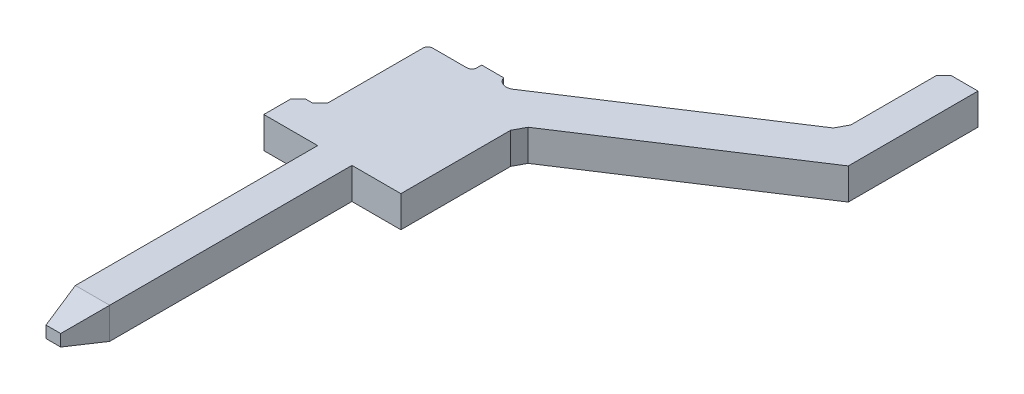
ISO-10303-21;
HEADER;
FILE_DESCRIPTION(('STEP AP214'),'2;1');
FILE_NAME('part.step','',(''),(''),'','','');
FILE_SCHEMA(('AUTOMOTIVE_DESIGN { 1 0 10303 214 1 1 1 1 }'));
ENDSEC;
DATA;
#1=APPLICATION_CONTEXT('core data for automotive mechanical design processes');
#2=APPLICATION_PROTOCOL_DEFINITION('international standard','automotive_design',2000,#1);
#3=PRODUCT_CONTEXT('',#1,'mechanical');
#4=PRODUCT('Part','Part','',(#3));
#5=PRODUCT_RELATED_PRODUCT_CATEGORY('part','',(#4));
#6=PRODUCT_DEFINITION_FORMATION('','',#4);
#7=PRODUCT_DEFINITION_CONTEXT('part definition',#1,'design');
#8=PRODUCT_DEFINITION('design','',#6,#7);
#9=PRODUCT_DEFINITION_SHAPE('','',#8);
#10=(LENGTH_UNIT() NAMED_UNIT(*) SI_UNIT(.MILLI.,.METRE.));
#11=(NAMED_UNIT(*) PLANE_ANGLE_UNIT() SI_UNIT($,.RADIAN.));
#12=(NAMED_UNIT(*) SI_UNIT($,.STERADIAN.) SOLID_ANGLE_UNIT());
#13=UNCERTAINTY_MEASURE_WITH_UNIT(LENGTH_MEASURE(1.E-05),#10,'distance_accuracy_value','');
#14=(GEOMETRIC_REPRESENTATION_CONTEXT(3) GLOBAL_UNCERTAINTY_ASSIGNED_CONTEXT((#13)) GLOBAL_UNIT_ASSIGNED_CONTEXT((#10,
#11,#12)) REPRESENTATION_CONTEXT('',''));
#15=CARTESIAN_POINT('',(0.,0.,0.));
#16=DIRECTION('',(0.,0.,1.));
#17=DIRECTION('',(1.,0.,0.));
#18=AXIS2_PLACEMENT_3D('',#15,#16,#17);
#19=CARTESIAN_POINT('',(-1.67,-16.82,-6.24));
#20=DIRECTION('',(0.,-1.,0.));
#21=DIRECTION('',(0.,0.,-1.));
#22=AXIS2_PLACEMENT_3D('',#19,#20,#21);
#23=CYLINDRICAL_SURFACE('',#22,0.1);
#24=CARTESIAN_POINT('',(-1.67,-16.82,-6.24));
#25=DIRECTION('',(0.,1.,0.));
#26=DIRECTION('',(0.,0.,-1.));
#27=AXIS2_PLACEMENT_3D('',#24,#25,#26);
#28=CIRCLE('',#27,0.1);
#29=CARTESIAN_POINT('',(-1.67,-16.82,-6.14));
#30=VERTEX_POINT('',#29);
#31=CARTESIAN_POINT('',(-1.57,-16.82,-6.24));
#32=VERTEX_POINT('',#31);
#33=EDGE_CURVE('E248',#30,#32,#28,.T.);
#34=ORIENTED_EDGE('',*,*,#33,.F.);
#35=DIRECTION('',(0.,-1.,0.));
#36=VECTOR('',#35,1.);
#37=CARTESIAN_POINT('',(-1.67,-16.82,-6.14));
#38=LINE('',#37,#36);
#39=CARTESIAN_POINT('',(-1.67,-16.18,-6.14));
#40=VERTEX_POINT('',#39);
#41=EDGE_CURVE('E308',#40,#30,#38,.T.);
#42=ORIENTED_EDGE('',*,*,#41,.F.);
#43=CARTESIAN_POINT('',(-1.67,-16.18,-6.24));
#44=DIRECTION('',(0.,-1.,0.));
#45=DIRECTION('',(0.,0.,-1.));
#46=AXIS2_PLACEMENT_3D('',#43,#44,#45);
#47=CIRCLE('',#46,0.1);
#48=CARTESIAN_POINT('',(-1.57,-16.18,-6.24));
#49=VERTEX_POINT('',#48);
#50=EDGE_CURVE('E41',#49,#40,#47,.T.);
#51=ORIENTED_EDGE('',*,*,#50,.F.);
#52=DIRECTION('',(0.,1.,0.));
#53=VECTOR('',#52,1.);
#54=CARTESIAN_POINT('',(-1.57,-16.18,-6.24));
#55=LINE('',#54,#53);
#56=EDGE_CURVE('E252',#32,#49,#55,.T.);
#57=ORIENTED_EDGE('',*,*,#56,.F.);
#58=EDGE_LOOP('',(#34,#42,#51,#57));
#59=FACE_BOUND('',#58,.T.);
#60=ADVANCED_FACE('F16',(#59),#23,.F.);
#61=CARTESIAN_POINT('',(-2.37,-16.82,-6.04));
#62=DIRECTION('',(0.,1.,0.));
#63=DIRECTION('',(0.,0.,1.));
#64=AXIS2_PLACEMENT_3D('',#61,#62,#63);
#65=CYLINDRICAL_SURFACE('',#64,0.1);
#66=CARTESIAN_POINT('',(-2.37,-16.82,-6.04));
#67=DIRECTION('',(0.,-1.,0.));
#68=DIRECTION('',(0.,0.,-1.));
#69=AXIS2_PLACEMENT_3D('',#66,#67,#68);
#70=CIRCLE('',#69,0.1);
#71=CARTESIAN_POINT('',(-2.47,-16.82,-6.04));
#72=VERTEX_POINT('',#71);
#73=CARTESIAN_POINT('',(-2.37,-16.82,-6.14));
#74=VERTEX_POINT('',#73);
#75=EDGE_CURVE('E386',#72,#74,#70,.T.);
#76=ORIENTED_EDGE('',*,*,#75,.F.);
#77=DIRECTION('',(0.,-1.,0.));
#78=VECTOR('',#77,1.);
#79=CARTESIAN_POINT('',(-2.47,-16.82,-6.04));
#80=LINE('',#79,#78);
#81=CARTESIAN_POINT('',(-2.47,-16.18,-6.04));
#82=VERTEX_POINT('',#81);
#83=EDGE_CURVE('E307',#82,#72,#80,.T.);
#84=ORIENTED_EDGE('',*,*,#83,.F.);
#85=CARTESIAN_POINT('',(-2.37,-16.18,-6.04));
#86=DIRECTION('',(0.,1.,0.));
#87=DIRECTION('',(0.,0.,-1.));
#88=AXIS2_PLACEMENT_3D('',#85,#86,#87);
#89=CIRCLE('',#88,0.1);
#90=CARTESIAN_POINT('',(-2.37,-16.18,-6.14));
#91=VERTEX_POINT('',#90);
#92=EDGE_CURVE('E361',#91,#82,#89,.T.);
#93=ORIENTED_EDGE('',*,*,#92,.F.);
#94=DIRECTION('',(0.,1.,0.));
#95=VECTOR('',#94,1.);
#96=CARTESIAN_POINT('',(-2.37,-16.82,-6.14));
#97=LINE('',#96,#95);
#98=EDGE_CURVE('E343',#74,#91,#97,.T.);
#99=ORIENTED_EDGE('',*,*,#98,.F.);
#100=EDGE_LOOP('',(#76,#84,#93,#99));
#101=FACE_BOUND('',#100,.T.);
#102=ADVANCED_FACE('F753',(#101),#65,.T.);
#103=CARTESIAN_POINT('',(-1.32,-16.82,2.51));
#104=DIRECTION('',(-0.970142500145332,0.,-0.242535625036333));
#105=DIRECTION('',(-0.242535625036333,0.,0.970142500145332));
#106=AXIS2_PLACEMENT_3D('',#103,#104,#105);
#107=PLANE('',#106);
#108=DIRECTION('',(0.235702260395516,-0.235702260395515,-0.942809041582064));
#109=VECTOR('',#108,1.);
#110=CARTESIAN_POINT('',(-1.34777777777778,-16.5922222222222,2.62111111111111));
#111=LINE('',#110,#109);
#112=CARTESIAN_POINT('',(-1.32,-16.62,2.51));
#113=VERTEX_POINT('',#112);
#114=CARTESIAN_POINT('',(-1.12,-16.82,1.71));
#115=VERTEX_POINT('',#114);
#116=EDGE_CURVE('E27',#113,#115,#111,.T.);
#117=ORIENTED_EDGE('',*,*,#116,.T.);
#118=DIRECTION('',(0.,-1.,0.));
#119=VECTOR('',#118,1.);
#120=CARTESIAN_POINT('',(-1.12,-16.82,1.71));
#121=LINE('',#120,#119);
#122=CARTESIAN_POINT('',(-1.12,-16.18,1.71));
#123=VERTEX_POINT('',#122);
#124=EDGE_CURVE('E287',#123,#115,#121,.T.);
#125=ORIENTED_EDGE('',*,*,#124,.F.);
#126=DIRECTION('',(-0.235702260395516,-0.235702260395515,0.942809041582064));
#127=VECTOR('',#126,1.);
#128=CARTESIAN_POINT('',(-1.10941237113952,-16.1694123711395,1.66764948455807));
#129=LINE('',#128,#127);
#130=CARTESIAN_POINT('',(-1.32,-16.38,2.51));
#131=VERTEX_POINT('',#130);
#132=EDGE_CURVE('E11',#123,#131,#129,.T.);
#133=ORIENTED_EDGE('',*,*,#132,.T.);
#134=DIRECTION('',(0.,1.,0.));
#135=VECTOR('',#134,1.);
#136=CARTESIAN_POINT('',(-1.32,-16.82,2.51));
#137=LINE('',#136,#135);
#138=EDGE_CURVE('E438',#113,#131,#137,.T.);
#139=ORIENTED_EDGE('',*,*,#138,.F.);
#140=EDGE_LOOP('',(#117,#125,#133,#139));
#141=FACE_BOUND('',#140,.T.);
#142=ADVANCED_FACE('F572',(#141),#107,.F.);
#143=CARTESIAN_POINT('',(-0.92942268051132,-16.18,1.71));
#144=DIRECTION('',(0.,0.970142500145332,0.242535625036333));
#145=DIRECTION('',(1.,0.,0.));
#146=AXIS2_PLACEMENT_3D('',#143,#144,#145);
#147=PLANE('',#146);
#148=DIRECTION('',(0.235702260395515,-0.235702260395516,0.942809041582064));
#149=VECTOR('',#148,1.);
#150=CARTESIAN_POINT('',(-1.78444444444444,-16.2155555555556,1.85222222222222));
#151=LINE('',#150,#149);
#152=CARTESIAN_POINT('',(-1.82,-16.18,1.71));
#153=VERTEX_POINT('',#152);
#154=CARTESIAN_POINT('',(-1.62,-16.38,2.51));
#155=VERTEX_POINT('',#154);
#156=EDGE_CURVE('E489',#153,#155,#151,.T.);
#157=ORIENTED_EDGE('',*,*,#156,.T.);
#158=DIRECTION('',(-1.,0.,0.));
#159=VECTOR('',#158,1.);
#160=CARTESIAN_POINT('',(-1.82,-16.38,2.51));
#161=LINE('',#160,#159);
#162=EDGE_CURVE('E20',#131,#155,#161,.T.);
#163=ORIENTED_EDGE('',*,*,#162,.F.);
#164=ORIENTED_EDGE('',*,*,#132,.F.);
#165=DIRECTION('',(1.,0.,0.));
#166=VECTOR('',#165,1.);
#167=CARTESIAN_POINT('',(-1.12,-16.18,1.71));
#168=LINE('',#167,#166);
#169=EDGE_CURVE('E321',#153,#123,#168,.T.);
#170=ORIENTED_EDGE('',*,*,#169,.F.);
#171=EDGE_LOOP('',(#157,#163,#164,#170));
#172=FACE_BOUND('',#171,.T.);
#173=ADVANCED_FACE('F578',(#172),#147,.T.);
#174=CARTESIAN_POINT('',(-1.82,-16.62,2.51));
#175=DIRECTION('',(0.,0.970142500145332,-0.242535625036333));
#176=DIRECTION('',(-1.,0.,0.));
#177=AXIS2_PLACEMENT_3D('',#174,#175,#176);
#178=PLANE('',#177);
#179=DIRECTION('',(-0.235702260395515,-0.235702260395516,-0.942809041582064));
#180=VECTOR('',#179,1.);
#181=CARTESIAN_POINT('',(-1.63111111111111,-16.6311111111111,2.46555555555556));
#182=LINE('',#181,#180);
#183=CARTESIAN_POINT('',(-1.62,-16.62,2.51));
#184=VERTEX_POINT('',#183);
#185=CARTESIAN_POINT('',(-1.82,-16.82,1.71));
#186=VERTEX_POINT('',#185);
#187=EDGE_CURVE('E486',#184,#186,#182,.T.);
#188=ORIENTED_EDGE('',*,*,#187,.T.);
#189=DIRECTION('',(-1.,0.,0.));
#190=VECTOR('',#189,1.);
#191=CARTESIAN_POINT('',(-0.92942268051132,-16.82,1.71));
#192=LINE('',#191,#190);
#193=EDGE_CURVE('E428',#115,#186,#192,.T.);
#194=ORIENTED_EDGE('',*,*,#193,.F.);
#195=ORIENTED_EDGE('',*,*,#116,.F.);
#196=DIRECTION('',(1.,0.,0.));
#197=VECTOR('',#196,1.);
#198=CARTESIAN_POINT('',(-1.82,-16.62,2.51));
#199=LINE('',#198,#197);
#200=EDGE_CURVE('E442',#184,#113,#199,.T.);
#201=ORIENTED_EDGE('',*,*,#200,.F.);
#202=EDGE_LOOP('',(#188,#194,#195,#201));
#203=FACE_BOUND('',#202,.T.);
#204=ADVANCED_FACE('F566',(#203),#178,.F.);
#205=CARTESIAN_POINT('',(-1.82,-16.82,1.71));
#206=DIRECTION('',(0.970142500145332,0.,-0.242535625036332));
#207=DIRECTION('',(0.,-1.,0.));
#208=AXIS2_PLACEMENT_3D('',#205,#206,#207);
#209=PLANE('',#208);
#210=ORIENTED_EDGE('',*,*,#156,.F.);
#211=DIRECTION('',(0.,1.,0.));
#212=VECTOR('',#211,1.);
#213=CARTESIAN_POINT('',(-1.82,-16.82,1.71));
#214=LINE('',#213,#212);
#215=EDGE_CURVE('E455',#186,#153,#214,.T.);
#216=ORIENTED_EDGE('',*,*,#215,.F.);
#217=ORIENTED_EDGE('',*,*,#187,.F.);
#218=DIRECTION('',(0.,-1.,0.));
#219=VECTOR('',#218,1.);
#220=CARTESIAN_POINT('',(-1.62,-16.82,2.51));
#221=LINE('',#220,#219);
#222=EDGE_CURVE('E329',#155,#184,#221,.T.);
#223=ORIENTED_EDGE('',*,*,#222,.F.);
#224=EDGE_LOOP('',(#210,#216,#217,#223));
#225=FACE_BOUND('',#224,.T.);
#226=ADVANCED_FACE('F683',(#225),#209,.F.);
#227=CARTESIAN_POINT('',(-2.47,-16.82,-4.09));
#228=DIRECTION('',(-0.707106781186549,0.,-0.707106781186547));
#229=DIRECTION('',(-0.707106781186547,0.,0.707106781186549));
#230=AXIS2_PLACEMENT_3D('',#227,#228,#229);
#231=PLANE('',#230);
#232=DIRECTION('',(0.707106781186547,0.,-0.707106781186549));
#233=VECTOR('',#232,1.);
#234=CARTESIAN_POINT('',(-2.47,-16.82,-4.09));
#235=LINE('',#234,#233);
#236=CARTESIAN_POINT('',(-2.62,-16.82,-3.94));
#237=VERTEX_POINT('',#236);
#238=CARTESIAN_POINT('',(-2.47,-16.82,-4.09));
#239=VERTEX_POINT('',#238);
#240=EDGE_CURVE('E358',#237,#239,#235,.T.);
#241=ORIENTED_EDGE('',*,*,#240,.F.);
#242=DIRECTION('',(0.,-1.,0.));
#243=VECTOR('',#242,1.);
#244=CARTESIAN_POINT('',(-2.62,-16.82,-3.94));
#245=LINE('',#244,#243);
#246=CARTESIAN_POINT('',(-2.62,-16.18,-3.94));
#247=VERTEX_POINT('',#246);
#248=EDGE_CURVE('E313',#247,#237,#245,.T.);
#249=ORIENTED_EDGE('',*,*,#248,.F.);
#250=DIRECTION('',(-0.707106781186547,0.,0.707106781186549));
#251=VECTOR('',#250,1.);
#252=CARTESIAN_POINT('',(-0.54437866275882,-16.18,-6.01562133724119));
#253=LINE('',#252,#251);
#254=CARTESIAN_POINT('',(-2.47,-16.18,-4.09));
#255=VERTEX_POINT('',#254);
#256=EDGE_CURVE('E363',#255,#247,#253,.T.);
#257=ORIENTED_EDGE('',*,*,#256,.F.);
#258=DIRECTION('',(0.,1.,0.));
#259=VECTOR('',#258,1.);
#260=CARTESIAN_POINT('',(-2.47,-16.18,-4.09));
#261=LINE('',#260,#259);
#262=EDGE_CURVE('E395',#239,#255,#261,.T.);
#263=ORIENTED_EDGE('',*,*,#262,.F.);
#264=EDGE_LOOP('',(#241,#249,#257,#263));
#265=FACE_BOUND('',#264,.T.);
#266=ADVANCED_FACE('F589',(#265),#231,.T.);
#267=CARTESIAN_POINT('',(3.26,-16.82,-9.05));
#268=DIRECTION('',(-0.87952072248373,0.,-0.475860587485135));
#269=DIRECTION('',(-0.475860587485135,0.,0.87952072248373));
#270=AXIS2_PLACEMENT_3D('',#267,#268,#269);
#271=PLANE('',#270);
#272=DIRECTION('',(0.475860587485135,0.,-0.87952072248373));
#273=VECTOR('',#272,1.);
#274=CARTESIAN_POINT('',(3.26,-16.82,-9.05));
#275=LINE('',#274,#273);
#276=CARTESIAN_POINT('',(3.13444122568806,-16.82,-8.81793298961651));
#277=VERTEX_POINT('',#276);
#278=CARTESIAN_POINT('',(3.26,-16.82,-9.05));
#279=VERTEX_POINT('',#278);
#280=EDGE_CURVE('E279',#277,#279,#275,.T.);
#281=ORIENTED_EDGE('',*,*,#280,.F.);
#282=DIRECTION('',(0.,-1.,0.));
#283=VECTOR('',#282,1.);
#284=CARTESIAN_POINT('',(3.13444122568806,-16.82,-8.81793298961651));
#285=LINE('',#284,#283);
#286=CARTESIAN_POINT('',(3.13444122568806,-16.18,-8.81793298961651));
#287=VERTEX_POINT('',#286);
#288=EDGE_CURVE('E473',#287,#277,#285,.T.);
#289=ORIENTED_EDGE('',*,*,#288,.F.);
#290=DIRECTION('',(-0.475860587485135,0.,0.87952072248373));
#291=VECTOR('',#290,1.);
#292=CARTESIAN_POINT('',(1.20250927258837,-16.18,-5.24719350862782));
#293=LINE('',#292,#291);
#294=CARTESIAN_POINT('',(3.26,-16.18,-9.05));
#295=VERTEX_POINT('',#294);
#296=EDGE_CURVE('E434',#295,#287,#293,.T.);
#297=ORIENTED_EDGE('',*,*,#296,.F.);
#298=DIRECTION('',(0.,1.,0.));
#299=VECTOR('',#298,1.);
#300=CARTESIAN_POINT('',(3.26,-16.18,-9.05));
#301=LINE('',#300,#299);
#302=EDGE_CURVE('E377',#279,#295,#301,.T.);
#303=ORIENTED_EDGE('',*,*,#302,.F.);
#304=EDGE_LOOP('',(#281,#289,#297,#303));
#305=FACE_BOUND('',#304,.T.);
#306=ADVANCED_FACE('F583',(#305),#271,.T.);
#307=CARTESIAN_POINT('',(-0.12,-16.82,-5.4832536559111));
#308=DIRECTION('',(0.879520722483731,0.,0.475860587485134));
#309=DIRECTION('',(0.,-1.,0.));
#310=AXIS2_PLACEMENT_3D('',#307,#308,#309);
#311=PLANE('',#310);
#312=DIRECTION('',(-0.475860587485134,0.,0.879520722483731));
#313=VECTOR('',#312,1.);
#314=CARTESIAN_POINT('',(-0.12,-16.82,-5.4832536559111));
#315=LINE('',#314,#313);
#316=CARTESIAN_POINT('',(0.00555877431193985,-16.82,-5.71532066629459));
#317=VERTEX_POINT('',#316);
#318=CARTESIAN_POINT('',(-0.12,-16.82,-5.4832536559111));
#319=VERTEX_POINT('',#318);
#320=EDGE_CURVE('E224',#317,#319,#315,.T.);
#321=ORIENTED_EDGE('',*,*,#320,.F.);
#322=DIRECTION('',(0.,-1.,0.));
#323=VECTOR('',#322,1.);
#324=CARTESIAN_POINT('',(0.00555877431193985,-16.82,-5.71532066629459));
#325=LINE('',#324,#323);
#326=CARTESIAN_POINT('',(0.00555877431193985,-16.18,-5.71532066629459));
#327=VERTEX_POINT('',#326);
#328=EDGE_CURVE('E424',#327,#317,#325,.T.);
#329=ORIENTED_EDGE('',*,*,#328,.F.);
#330=DIRECTION('',(0.475860587485134,0.,-0.879520722483731));
#331=VECTOR('',#330,1.);
#332=CARTESIAN_POINT('',(0.0806752864189999,-16.18,-5.8541565580166));
#333=LINE('',#332,#331);
#334=CARTESIAN_POINT('',(-0.12,-16.18,-5.4832536559111));
#335=VERTEX_POINT('',#334);
#336=EDGE_CURVE('E213',#335,#327,#333,.T.);
#337=ORIENTED_EDGE('',*,*,#336,.F.);
#338=DIRECTION('',(0.,1.,0.));
#339=VECTOR('',#338,1.);
#340=CARTESIAN_POINT('',(-0.12,-16.18,-5.4832536559111));
#341=LINE('',#340,#339);
#342=EDGE_CURVE('E369',#319,#335,#341,.T.);
#343=ORIENTED_EDGE('',*,*,#342,.F.);
#344=EDGE_LOOP('',(#321,#329,#337,#343));
#345=FACE_BOUND('',#344,.T.);
#346=ADVANCED_FACE('F588',(#345),#311,.T.);
#347=CARTESIAN_POINT('',(3.41,-16.82,-10.95));
#348=DIRECTION('',(0.707106781186548,0.,0.707106781186548));
#349=DIRECTION('',(0.,-1.,0.));
#350=AXIS2_PLACEMENT_3D('',#347,#348,#349);
#351=PLANE('',#350);
#352=DIRECTION('',(0.707106781186548,0.,-0.707106781186548));
#353=VECTOR('',#352,1.);
#354=CARTESIAN_POINT('',(-1.03437866275882,-16.82,-6.50562133724118));
#355=LINE('',#354,#353);
#356=CARTESIAN_POINT('',(3.26,-16.82,-10.8));
#357=VERTEX_POINT('',#356);
#358=CARTESIAN_POINT('',(3.41,-16.82,-10.95));
#359=VERTEX_POINT('',#358);
#360=EDGE_CURVE('E278',#357,#359,#355,.T.);
#361=ORIENTED_EDGE('',*,*,#360,.F.);
#362=DIRECTION('',(0.,-1.,0.));
#363=VECTOR('',#362,1.);
#364=CARTESIAN_POINT('',(3.26,-16.82,-10.8));
#365=LINE('',#364,#363);
#366=CARTESIAN_POINT('',(3.26,-16.18,-10.8));
#367=VERTEX_POINT('',#366);
#368=EDGE_CURVE('E378',#367,#357,#365,.T.);
#369=ORIENTED_EDGE('',*,*,#368,.F.);
#370=DIRECTION('',(-0.707106781186548,0.,0.707106781186548));
#371=VECTOR('',#370,1.);
#372=CARTESIAN_POINT('',(3.41,-16.18,-10.95));
#373=LINE('',#372,#371);
#374=CARTESIAN_POINT('',(3.41,-16.18,-10.95));
#375=VERTEX_POINT('',#374);
#376=EDGE_CURVE('E431',#375,#367,#373,.T.);
#377=ORIENTED_EDGE('',*,*,#376,.F.);
#378=DIRECTION('',(0.,1.,0.));
#379=VECTOR('',#378,1.);
#380=CARTESIAN_POINT('',(3.41,-16.82,-10.95));
#381=LINE('',#380,#379);
#382=EDGE_CURVE('E338',#359,#375,#381,.T.);
#383=ORIENTED_EDGE('',*,*,#382,.F.);
#384=EDGE_LOOP('',(#361,#369,#377,#383));
#385=FACE_BOUND('',#384,.T.);
#386=ADVANCED_FACE('F603',(#385),#351,.F.);
#387=CARTESIAN_POINT('',(-2.77,-16.82,-3.94));
#388=DIRECTION('',(0.707106781186548,0.,0.707106781186548));
#389=DIRECTION('',(0.,-1.,0.));
#390=AXIS2_PLACEMENT_3D('',#387,#388,#389);
#391=PLANE('',#390);
#392=DIRECTION('',(0.707106781186548,0.,-0.707106781186548));
#393=VECTOR('',#392,1.);
#394=CARTESIAN_POINT('',(-0.619378662758818,-16.82,-6.09062133724118));
#395=LINE('',#394,#393);
#396=CARTESIAN_POINT('',(-2.92,-16.82,-3.79));
#397=VERTEX_POINT('',#396);
#398=CARTESIAN_POINT('',(-2.77,-16.82,-3.94));
#399=VERTEX_POINT('',#398);
#400=EDGE_CURVE('E362',#397,#399,#395,.T.);
#401=ORIENTED_EDGE('',*,*,#400,.F.);
#402=DIRECTION('',(0.,-1.,0.));
#403=VECTOR('',#402,1.);
#404=CARTESIAN_POINT('',(-2.92,-16.82,-3.79));
#405=LINE('',#404,#403);
#406=CARTESIAN_POINT('',(-2.92,-16.18,-3.79));
#407=VERTEX_POINT('',#406);
#408=EDGE_CURVE('E448',#407,#397,#405,.T.);
#409=ORIENTED_EDGE('',*,*,#408,.F.);
#410=DIRECTION('',(-0.707106781186548,0.,0.707106781186548));
#411=VECTOR('',#410,1.);
#412=CARTESIAN_POINT('',(-2.77,-16.18,-3.94));
#413=LINE('',#412,#411);
#414=CARTESIAN_POINT('',(-2.77,-16.18,-3.94));
#415=VERTEX_POINT('',#414);
#416=EDGE_CURVE('E325',#415,#407,#413,.T.);
#417=ORIENTED_EDGE('',*,*,#416,.F.);
#418=DIRECTION('',(0.,1.,0.));
#419=VECTOR('',#418,1.);
#420=CARTESIAN_POINT('',(-2.77,-16.82,-3.94));
#421=LINE('',#420,#419);
#422=EDGE_CURVE('E314',#399,#415,#421,.T.);
#423=ORIENTED_EDGE('',*,*,#422,.F.);
#424=EDGE_LOOP('',(#401,#409,#417,#423));
#425=FACE_BOUND('',#424,.T.);
#426=ADVANCED_FACE('F598',(#425),#391,.F.);
#427=CARTESIAN_POINT('',(-0.92942268051132,-16.18,-6.40066535499368));
#428=DIRECTION('',(0.,-1.,0.));
#429=DIRECTION('',(0.,0.,-1.));
#430=AXIS2_PLACEMENT_3D('',#427,#428,#429);
#431=PLANE('',#430);
#432=DIRECTION('',(-1.,0.,0.));
#433=VECTOR('',#432,1.);
#434=CARTESIAN_POINT('',(-1.57,-16.18,-6.14));
#435=LINE('',#434,#433);
#436=EDGE_CURVE('E347',#40,#91,#435,.T.);
#437=ORIENTED_EDGE('',*,*,#436,.T.);
#438=ORIENTED_EDGE('',*,*,#92,.T.);
#439=DIRECTION('',(0.,0.,1.));
#440=VECTOR('',#439,1.);
#441=CARTESIAN_POINT('',(-2.47,-16.18,-6.14));
#442=LINE('',#441,#440);
#443=EDGE_CURVE('E303',#82,#255,#442,.T.);
#444=ORIENTED_EDGE('',*,*,#443,.T.);
#445=ORIENTED_EDGE('',*,*,#256,.T.);
#446=DIRECTION('',(-1.,0.,0.));
#447=VECTOR('',#446,1.);
#448=CARTESIAN_POINT('',(-2.47,-16.18,-3.94));
#449=LINE('',#448,#447);
#450=EDGE_CURVE('E309',#247,#415,#449,.T.);
#451=ORIENTED_EDGE('',*,*,#450,.T.);
#452=ORIENTED_EDGE('',*,*,#416,.T.);
#453=DIRECTION('',(0.,0.,1.));
#454=VECTOR('',#453,1.);
#455=CARTESIAN_POINT('',(-2.92,-16.18,-3.94));
#456=LINE('',#455,#454);
#457=CARTESIAN_POINT('',(-2.92,-16.18,-3.24));
#458=VERTEX_POINT('',#457);
#459=EDGE_CURVE('E276',#407,#458,#456,.T.);
#460=ORIENTED_EDGE('',*,*,#459,.T.);
#461=DIRECTION('',(1.,0.,0.));
#462=VECTOR('',#461,1.);
#463=CARTESIAN_POINT('',(-2.92,-16.18,-3.24));
#464=LINE('',#463,#462);
#465=CARTESIAN_POINT('',(-1.82,-16.18,-3.24));
#466=VERTEX_POINT('',#465);
#467=EDGE_CURVE('E298',#458,#466,#464,.T.);
#468=ORIENTED_EDGE('',*,*,#467,.T.);
#469=DIRECTION('',(0.,0.,1.));
#470=VECTOR('',#469,1.);
#471=CARTESIAN_POINT('',(-1.82,-16.18,-3.24));
#472=LINE('',#471,#470);
#473=EDGE_CURVE('E482',#466,#153,#472,.T.);
#474=ORIENTED_EDGE('',*,*,#473,.T.);
#475=ORIENTED_EDGE('',*,*,#169,.T.);
#476=DIRECTION('',(0.,0.,-1.));
#477=VECTOR('',#476,1.);
#478=CARTESIAN_POINT('',(-1.12,-16.18,2.51));
#479=LINE('',#478,#477);
#480=CARTESIAN_POINT('',(-1.12,-16.18,-3.24));
#481=VERTEX_POINT('',#480);
#482=EDGE_CURVE('E292',#123,#481,#479,.T.);
#483=ORIENTED_EDGE('',*,*,#482,.T.);
#484=DIRECTION('',(1.,0.,0.));
#485=VECTOR('',#484,1.);
#486=CARTESIAN_POINT('',(-1.12,-16.18,-3.24));
#487=LINE('',#486,#485);
#488=CARTESIAN_POINT('',(-0.12,-16.18,-3.24));
#489=VERTEX_POINT('',#488);
#490=EDGE_CURVE('E414',#481,#489,#487,.T.);
#491=ORIENTED_EDGE('',*,*,#490,.T.);
#492=DIRECTION('',(0.,0.,-1.));
#493=VECTOR('',#492,1.);
#494=CARTESIAN_POINT('',(-0.12,-16.18,-3.24));
#495=LINE('',#494,#493);
#496=EDGE_CURVE('E425',#489,#335,#495,.T.);
#497=ORIENTED_EDGE('',*,*,#496,.T.);
#498=ORIENTED_EDGE('',*,*,#336,.T.);
#499=DIRECTION('',(0.837058495412916,0.,-0.547113402556605));
#500=VECTOR('',#499,1.);
#501=CARTESIAN_POINT('',(-0.12,-16.18,-5.6332536559111));
#502=LINE('',#501,#500);
#503=CARTESIAN_POINT('',(3.96,-16.18,-8.3));
#504=VERTEX_POINT('',#503);
#505=EDGE_CURVE('E420',#327,#504,#502,.T.);
#506=ORIENTED_EDGE('',*,*,#505,.T.);
#507=DIRECTION('',(0.,0.,-1.));
#508=VECTOR('',#507,1.);
#509=CARTESIAN_POINT('',(3.96,-16.18,-8.3));
#510=LINE('',#509,#508);
#511=CARTESIAN_POINT('',(3.96,-16.18,-10.95));
#512=VERTEX_POINT('',#511);
#513=EDGE_CURVE('E319',#504,#512,#510,.T.);
#514=ORIENTED_EDGE('',*,*,#513,.T.);
#515=DIRECTION('',(-1.,0.,0.));
#516=VECTOR('',#515,1.);
#517=CARTESIAN_POINT('',(3.96,-16.18,-10.95));
#518=LINE('',#517,#516);
#519=EDGE_CURVE('E333',#512,#375,#518,.T.);
#520=ORIENTED_EDGE('',*,*,#519,.T.);
#521=ORIENTED_EDGE('',*,*,#376,.T.);
#522=DIRECTION('',(0.,0.,1.));
#523=VECTOR('',#522,1.);
#524=CARTESIAN_POINT('',(3.26,-16.18,-10.95));
#525=LINE('',#524,#523);
#526=EDGE_CURVE('E337',#367,#295,#525,.T.);
#527=ORIENTED_EDGE('',*,*,#526,.T.);
#528=ORIENTED_EDGE('',*,*,#296,.T.);
#529=DIRECTION('',(-0.837058495412916,0.,0.547113402556605));
#530=VECTOR('',#529,1.);
#531=CARTESIAN_POINT('',(3.26,-16.18,-8.9));
#532=LINE('',#531,#530);
#533=CARTESIAN_POINT('',(-0.82,-16.18,-6.2332536559111));
#534=VERTEX_POINT('',#533);
#535=EDGE_CURVE('E383',#287,#534,#532,.T.);
#536=ORIENTED_EDGE('',*,*,#535,.T.);
#537=CARTESIAN_POINT('',(-0.92942268051132,-16.18,-6.40066535499368));
#538=DIRECTION('',(0.,-1.,0.));
#539=DIRECTION('',(0.,0.,-1.));
#540=AXIS2_PLACEMENT_3D('',#537,#538,#539);
#541=CIRCLE('',#540,0.2);
#542=CARTESIAN_POINT('',(-1.12,-16.18,-6.34));
#543=VERTEX_POINT('',#542);
#544=EDGE_CURVE('E302',#534,#543,#541,.T.);
#545=ORIENTED_EDGE('',*,*,#544,.T.);
#546=DIRECTION('',(-1.,0.,0.));
#547=VECTOR('',#546,1.);
#548=CARTESIAN_POINT('',(-1.12,-16.18,-6.34));
#549=LINE('',#548,#547);
#550=CARTESIAN_POINT('',(-1.57,-16.18,-6.34));
#551=VERTEX_POINT('',#550);
#552=EDGE_CURVE('E267',#543,#551,#549,.T.);
#553=ORIENTED_EDGE('',*,*,#552,.T.);
#554=DIRECTION('',(0.,0.,1.));
#555=VECTOR('',#554,1.);
#556=CARTESIAN_POINT('',(-1.57,-16.18,-6.34));
#557=LINE('',#556,#555);
#558=EDGE_CURVE('E257',#551,#49,#557,.T.);
#559=ORIENTED_EDGE('',*,*,#558,.T.);
#560=ORIENTED_EDGE('',*,*,#50,.T.);
#561=EDGE_LOOP('',(#437,#438,#444,#445,#451,#452,#460,#468,#474,#475,#483,#491,#497,#498,#506,
#514,#520,#521,#527,#528,#536,#545,#553,#559,#560));
#562=FACE_BOUND('',#561,.T.);
#563=ADVANCED_FACE('F18',(#562),#431,.F.);
#564=CARTESIAN_POINT('',(-0.92942268051132,-16.82,-6.40066535499368));
#565=DIRECTION('',(0.,-1.,0.));
#566=DIRECTION('',(0.,0.,-1.));
#567=AXIS2_PLACEMENT_3D('',#564,#565,#566);
#568=PLANE('',#567);
#569=DIRECTION('',(0.,0.,1.));
#570=VECTOR('',#569,1.);
#571=CARTESIAN_POINT('',(-2.47,-16.82,-6.14));
#572=LINE('',#571,#570);
#573=EDGE_CURVE('E373',#72,#239,#572,.T.);
#574=ORIENTED_EDGE('',*,*,#573,.F.);
#575=ORIENTED_EDGE('',*,*,#75,.T.);
#576=DIRECTION('',(-1.,0.,0.));
#577=VECTOR('',#576,1.);
#578=CARTESIAN_POINT('',(-1.57,-16.82,-6.14));
#579=LINE('',#578,#577);
#580=EDGE_CURVE('E348',#30,#74,#579,.T.);
#581=ORIENTED_EDGE('',*,*,#580,.F.);
#582=ORIENTED_EDGE('',*,*,#33,.T.);
#583=DIRECTION('',(0.,0.,1.));
#584=VECTOR('',#583,1.);
#585=CARTESIAN_POINT('',(-1.57,-16.82,-6.34));
#586=LINE('',#585,#584);
#587=CARTESIAN_POINT('',(-1.57,-16.82,-6.34));
#588=VERTEX_POINT('',#587);
#589=EDGE_CURVE('E240',#588,#32,#586,.T.);
#590=ORIENTED_EDGE('',*,*,#589,.F.);
#591=DIRECTION('',(-1.,0.,0.));
#592=VECTOR('',#591,1.);
#593=CARTESIAN_POINT('',(-1.12,-16.82,-6.34));
#594=LINE('',#593,#592);
#595=CARTESIAN_POINT('',(-1.12,-16.82,-6.34));
#596=VERTEX_POINT('',#595);
#597=EDGE_CURVE('E245',#596,#588,#594,.T.);
#598=ORIENTED_EDGE('',*,*,#597,.F.);
#599=CARTESIAN_POINT('',(-0.92942268051132,-16.82,-6.40066535499368));
#600=DIRECTION('',(0.,-1.,0.));
#601=DIRECTION('',(0.,0.,-1.));
#602=AXIS2_PLACEMENT_3D('',#599,#600,#601);
#603=CIRCLE('',#602,0.2);
#604=CARTESIAN_POINT('',(-0.82,-16.82,-6.2332536559111));
#605=VERTEX_POINT('',#604);
#606=EDGE_CURVE('E299',#605,#596,#603,.T.);
#607=ORIENTED_EDGE('',*,*,#606,.F.);
#608=DIRECTION('',(-0.837058495412916,0.,0.547113402556605));
#609=VECTOR('',#608,1.);
#610=CARTESIAN_POINT('',(3.26,-16.82,-8.9));
#611=LINE('',#610,#609);
#612=EDGE_CURVE('E469',#277,#605,#611,.T.);
#613=ORIENTED_EDGE('',*,*,#612,.F.);
#614=ORIENTED_EDGE('',*,*,#280,.T.);
#615=DIRECTION('',(0.,0.,1.));
#616=VECTOR('',#615,1.);
#617=CARTESIAN_POINT('',(3.26,-16.82,-10.95));
#618=LINE('',#617,#616);
#619=EDGE_CURVE('E374',#357,#279,#618,.T.);
#620=ORIENTED_EDGE('',*,*,#619,.F.);
#621=ORIENTED_EDGE('',*,*,#360,.T.);
#622=DIRECTION('',(-1.,0.,0.));
#623=VECTOR('',#622,1.);
#624=CARTESIAN_POINT('',(3.96,-16.82,-10.95));
#625=LINE('',#624,#623);
#626=CARTESIAN_POINT('',(3.96,-16.82,-10.95));
#627=VERTEX_POINT('',#626);
#628=EDGE_CURVE('E356',#627,#359,#625,.T.);
#629=ORIENTED_EDGE('',*,*,#628,.F.);
#630=DIRECTION('',(0.,0.,-1.));
#631=VECTOR('',#630,1.);
#632=CARTESIAN_POINT('',(3.96,-16.82,-8.3));
#633=LINE('',#632,#631);
#634=CARTESIAN_POINT('',(3.96,-16.82,-8.3));
#635=VERTEX_POINT('',#634);
#636=EDGE_CURVE('E357',#635,#627,#633,.T.);
#637=ORIENTED_EDGE('',*,*,#636,.F.);
#638=DIRECTION('',(0.837058495412916,0.,-0.547113402556605));
#639=VECTOR('',#638,1.);
#640=CARTESIAN_POINT('',(-0.12,-16.82,-5.6332536559111));
#641=LINE('',#640,#639);
#642=EDGE_CURVE('E320',#317,#635,#641,.T.);
#643=ORIENTED_EDGE('',*,*,#642,.F.);
#644=ORIENTED_EDGE('',*,*,#320,.T.);
#645=DIRECTION('',(0.,0.,-1.));
#646=VECTOR('',#645,1.);
#647=CARTESIAN_POINT('',(-0.12,-16.82,-3.24));
#648=LINE('',#647,#646);
#649=CARTESIAN_POINT('',(-0.12,-16.82,-3.24));
#650=VERTEX_POINT('',#649);
#651=EDGE_CURVE('E285',#650,#319,#648,.T.);
#652=ORIENTED_EDGE('',*,*,#651,.F.);
#653=DIRECTION('',(1.,0.,0.));
#654=VECTOR('',#653,1.);
#655=CARTESIAN_POINT('',(-1.12,-16.82,-3.24));
#656=LINE('',#655,#654);
#657=CARTESIAN_POINT('',(-1.12,-16.82,-3.24));
#658=VERTEX_POINT('',#657);
#659=EDGE_CURVE('E286',#658,#650,#656,.T.);
#660=ORIENTED_EDGE('',*,*,#659,.F.);
#661=DIRECTION('',(0.,0.,-1.));
#662=VECTOR('',#661,1.);
#663=CARTESIAN_POINT('',(-1.12,-16.82,2.51));
#664=LINE('',#663,#662);
#665=EDGE_CURVE('E291',#115,#658,#664,.T.);
#666=ORIENTED_EDGE('',*,*,#665,.F.);
#667=ORIENTED_EDGE('',*,*,#193,.T.);
#668=DIRECTION('',(0.,0.,1.));
#669=VECTOR('',#668,1.);
#670=CARTESIAN_POINT('',(-1.82,-16.82,-3.24));
#671=LINE('',#670,#669);
#672=CARTESIAN_POINT('',(-1.82,-16.82,-3.24));
#673=VERTEX_POINT('',#672);
#674=EDGE_CURVE('E410',#673,#186,#671,.T.);
#675=ORIENTED_EDGE('',*,*,#674,.F.);
#676=DIRECTION('',(1.,0.,0.));
#677=VECTOR('',#676,1.);
#678=CARTESIAN_POINT('',(-2.92,-16.82,-3.24));
#679=LINE('',#678,#677);
#680=CARTESIAN_POINT('',(-2.92,-16.82,-3.24));
#681=VERTEX_POINT('',#680);
#682=EDGE_CURVE('E293',#681,#673,#679,.T.);
#683=ORIENTED_EDGE('',*,*,#682,.F.);
#684=DIRECTION('',(0.,0.,1.));
#685=VECTOR('',#684,1.);
#686=CARTESIAN_POINT('',(-2.92,-16.82,-3.94));
#687=LINE('',#686,#685);
#688=EDGE_CURVE('E403',#397,#681,#687,.T.);
#689=ORIENTED_EDGE('',*,*,#688,.F.);
#690=ORIENTED_EDGE('',*,*,#400,.T.);
#691=DIRECTION('',(-1.,0.,0.));
#692=VECTOR('',#691,1.);
#693=CARTESIAN_POINT('',(-2.47,-16.82,-3.94));
#694=LINE('',#693,#692);
#695=EDGE_CURVE('E342',#237,#399,#694,.T.);
#696=ORIENTED_EDGE('',*,*,#695,.F.);
#697=ORIENTED_EDGE('',*,*,#240,.T.);
#698=EDGE_LOOP('',(#574,#575,#581,#582,#590,#598,#607,#613,#614,#620,#621,#629,#637,#643,#644,
#652,#660,#666,#667,#675,#683,#689,#690,#696,#697));
#699=FACE_BOUND('',#698,.T.);
#700=ADVANCED_FACE('F243',(#699),#568,.T.);
#701=CARTESIAN_POINT('',(-1.57,-16.82,-6.34));
#702=DIRECTION('',(-1.,0.,0.));
#703=DIRECTION('',(0.,0.,1.));
#704=AXIS2_PLACEMENT_3D('',#701,#702,#703);
#705=PLANE('',#704);
#706=ORIENTED_EDGE('',*,*,#589,.T.);
#707=ORIENTED_EDGE('',*,*,#56,.T.);
#708=ORIENTED_EDGE('',*,*,#558,.F.);
#709=DIRECTION('',(0.,1.,0.));
#710=VECTOR('',#709,1.);
#711=CARTESIAN_POINT('',(-1.57,-16.82,-6.34));
#712=LINE('',#711,#710);
#713=EDGE_CURVE('E253',#588,#551,#712,.T.);
#714=ORIENTED_EDGE('',*,*,#713,.F.);
#715=EDGE_LOOP('',(#706,#707,#708,#714));
#716=FACE_BOUND('',#715,.T.);
#717=ADVANCED_FACE('F256',(#716),#705,.T.);
#718=CARTESIAN_POINT('',(-1.12,-16.82,-6.34));
#719=DIRECTION('',(0.,0.,-1.));
#720=DIRECTION('',(0.,-1.,0.));
#721=AXIS2_PLACEMENT_3D('',#718,#719,#720);
#722=PLANE('',#721);
#723=ORIENTED_EDGE('',*,*,#552,.F.);
#724=DIRECTION('',(0.,1.,0.));
#725=VECTOR('',#724,1.);
#726=CARTESIAN_POINT('',(-1.12,-16.82,-6.34));
#727=LINE('',#726,#725);
#728=EDGE_CURVE('E264',#596,#543,#727,.T.);
#729=ORIENTED_EDGE('',*,*,#728,.F.);
#730=ORIENTED_EDGE('',*,*,#597,.T.);
#731=ORIENTED_EDGE('',*,*,#713,.T.);
#732=EDGE_LOOP('',(#723,#729,#730,#731));
#733=FACE_BOUND('',#732,.T.);
#734=ADVANCED_FACE('F262',(#733),#722,.T.);
#735=CARTESIAN_POINT('',(-0.92942268051132,-16.82,-6.40066535499368));
#736=DIRECTION('',(0.,1.,0.));
#737=DIRECTION('',(0.,0.,1.));
#738=AXIS2_PLACEMENT_3D('',#735,#736,#737);
#739=CYLINDRICAL_SURFACE('',#738,0.2);
#740=ORIENTED_EDGE('',*,*,#544,.F.);
#741=DIRECTION('',(0.,1.,0.));
#742=VECTOR('',#741,1.);
#743=CARTESIAN_POINT('',(-0.82,-16.82,-6.2332536559111));
#744=LINE('',#743,#742);
#745=EDGE_CURVE('E459',#605,#534,#744,.T.);
#746=ORIENTED_EDGE('',*,*,#745,.F.);
#747=ORIENTED_EDGE('',*,*,#606,.T.);
#748=ORIENTED_EDGE('',*,*,#728,.T.);
#749=EDGE_LOOP('',(#740,#746,#747,#748));
#750=FACE_BOUND('',#749,.T.);
#751=ADVANCED_FACE('F649',(#750),#739,.F.);
#752=CARTESIAN_POINT('',(3.26,-16.82,-8.9));
#753=DIRECTION('',(-0.547113402556605,0.,-0.837058495412916));
#754=DIRECTION('',(-0.837058495412916,0.,0.547113402556605));
#755=AXIS2_PLACEMENT_3D('',#752,#753,#754);
#756=PLANE('',#755);
#757=ORIENTED_EDGE('',*,*,#535,.F.);
#758=ORIENTED_EDGE('',*,*,#288,.T.);
#759=ORIENTED_EDGE('',*,*,#612,.T.);
#760=ORIENTED_EDGE('',*,*,#745,.T.);
#761=EDGE_LOOP('',(#757,#758,#759,#760));
#762=FACE_BOUND('',#761,.T.);
#763=ADVANCED_FACE('F638',(#762),#756,.T.);
#764=CARTESIAN_POINT('',(3.26,-16.82,-10.95));
#765=DIRECTION('',(-1.,0.,0.));
#766=DIRECTION('',(0.,0.,1.));
#767=AXIS2_PLACEMENT_3D('',#764,#765,#766);
#768=PLANE('',#767);
#769=ORIENTED_EDGE('',*,*,#526,.F.);
#770=ORIENTED_EDGE('',*,*,#368,.T.);
#771=ORIENTED_EDGE('',*,*,#619,.T.);
#772=ORIENTED_EDGE('',*,*,#302,.T.);
#773=EDGE_LOOP('',(#769,#770,#771,#772));
#774=FACE_BOUND('',#773,.T.);
#775=ADVANCED_FACE('F632',(#774),#768,.T.);
#776=CARTESIAN_POINT('',(3.96,-16.82,-10.95));
#777=DIRECTION('',(0.,0.,-1.));
#778=DIRECTION('',(0.,-1.,0.));
#779=AXIS2_PLACEMENT_3D('',#776,#777,#778);
#780=PLANE('',#779);
#781=ORIENTED_EDGE('',*,*,#628,.T.);
#782=ORIENTED_EDGE('',*,*,#382,.T.);
#783=ORIENTED_EDGE('',*,*,#519,.F.);
#784=DIRECTION('',(0.,1.,0.));
#785=VECTOR('',#784,1.);
#786=CARTESIAN_POINT('',(3.96,-16.82,-10.95));
#787=LINE('',#786,#785);
#788=EDGE_CURVE('E352',#627,#512,#787,.T.);
#789=ORIENTED_EDGE('',*,*,#788,.F.);
#790=EDGE_LOOP('',(#781,#782,#783,#789));
#791=FACE_BOUND('',#790,.T.);
#792=ADVANCED_FACE('F637',(#791),#780,.T.);
#793=CARTESIAN_POINT('',(3.96,-16.82,-8.3));
#794=DIRECTION('',(1.,0.,0.));
#795=DIRECTION('',(0.,1.,0.));
#796=AXIS2_PLACEMENT_3D('',#793,#794,#795);
#797=PLANE('',#796);
#798=ORIENTED_EDGE('',*,*,#513,.F.);
#799=DIRECTION('',(0.,1.,0.));
#800=VECTOR('',#799,1.);
#801=CARTESIAN_POINT('',(3.96,-16.82,-8.3));
#802=LINE('',#801,#800);
#803=EDGE_CURVE('E315',#635,#504,#802,.T.);
#804=ORIENTED_EDGE('',*,*,#803,.F.);
#805=ORIENTED_EDGE('',*,*,#636,.T.);
#806=ORIENTED_EDGE('',*,*,#788,.T.);
#807=EDGE_LOOP('',(#798,#804,#805,#806));
#808=FACE_BOUND('',#807,.T.);
#809=ADVANCED_FACE('F673',(#808),#797,.T.);
#810=CARTESIAN_POINT('',(-0.12,-16.82,-5.6332536559111));
#811=DIRECTION('',(0.547113402556605,0.,0.837058495412916));
#812=DIRECTION('',(0.,-1.,0.));
#813=AXIS2_PLACEMENT_3D('',#810,#811,#812);
#814=PLANE('',#813);
#815=ORIENTED_EDGE('',*,*,#505,.F.);
#816=ORIENTED_EDGE('',*,*,#328,.T.);
#817=ORIENTED_EDGE('',*,*,#642,.T.);
#818=ORIENTED_EDGE('',*,*,#803,.T.);
#819=EDGE_LOOP('',(#815,#816,#817,#818));
#820=FACE_BOUND('',#819,.T.);
#821=ADVANCED_FACE('F762',(#820),#814,.T.);
#822=CARTESIAN_POINT('',(-0.12,-16.82,-3.24));
#823=DIRECTION('',(1.,0.,0.));
#824=DIRECTION('',(0.,1.,0.));
#825=AXIS2_PLACEMENT_3D('',#822,#823,#824);
#826=PLANE('',#825);
#827=ORIENTED_EDGE('',*,*,#651,.T.);
#828=ORIENTED_EDGE('',*,*,#342,.T.);
#829=ORIENTED_EDGE('',*,*,#496,.F.);
#830=DIRECTION('',(0.,1.,0.));
#831=VECTOR('',#830,1.);
#832=CARTESIAN_POINT('',(-0.12,-16.82,-3.24));
#833=LINE('',#832,#831);
#834=EDGE_CURVE('E281',#650,#489,#833,.T.);
#835=ORIENTED_EDGE('',*,*,#834,.F.);
#836=EDGE_LOOP('',(#827,#828,#829,#835));
#837=FACE_BOUND('',#836,.T.);
#838=ADVANCED_FACE('F702',(#837),#826,.T.);
#839=CARTESIAN_POINT('',(-1.12,-16.82,-3.24));
#840=DIRECTION('',(0.,0.,1.));
#841=DIRECTION('',(1.,0.,0.));
#842=AXIS2_PLACEMENT_3D('',#839,#840,#841);
#843=PLANE('',#842);
#844=ORIENTED_EDGE('',*,*,#490,.F.);
#845=DIRECTION('',(0.,1.,0.));
#846=VECTOR('',#845,1.);
#847=CARTESIAN_POINT('',(-1.12,-16.82,-3.24));
#848=LINE('',#847,#846);
#849=EDGE_CURVE('E465',#658,#481,#848,.T.);
#850=ORIENTED_EDGE('',*,*,#849,.F.);
#851=ORIENTED_EDGE('',*,*,#659,.T.);
#852=ORIENTED_EDGE('',*,*,#834,.T.);
#853=EDGE_LOOP('',(#844,#850,#851,#852));
#854=FACE_BOUND('',#853,.T.);
#855=ADVANCED_FACE('F624',(#854),#843,.T.);
#856=CARTESIAN_POINT('',(-1.12,-16.82,2.51));
#857=DIRECTION('',(1.,0.,0.));
#858=DIRECTION('',(0.,1.,0.));
#859=AXIS2_PLACEMENT_3D('',#856,#857,#858);
#860=PLANE('',#859);
#861=ORIENTED_EDGE('',*,*,#482,.F.);
#862=ORIENTED_EDGE('',*,*,#124,.T.);
#863=ORIENTED_EDGE('',*,*,#665,.T.);
#864=ORIENTED_EDGE('',*,*,#849,.T.);
#865=EDGE_LOOP('',(#861,#862,#863,#864));
#866=FACE_BOUND('',#865,.T.);
#867=ADVANCED_FACE('F619',(#866),#860,.T.);
#868=CARTESIAN_POINT('',(-1.82,-16.82,2.51));
#869=DIRECTION('',(0.,0.,1.));
#870=DIRECTION('',(1.,0.,0.));
#871=AXIS2_PLACEMENT_3D('',#868,#869,#870);
#872=PLANE('',#871);
#873=ORIENTED_EDGE('',*,*,#200,.T.);
#874=ORIENTED_EDGE('',*,*,#138,.T.);
#875=ORIENTED_EDGE('',*,*,#162,.T.);
#876=ORIENTED_EDGE('',*,*,#222,.T.);
#877=EDGE_LOOP('',(#873,#874,#875,#876));
#878=FACE_BOUND('',#877,.T.);
#879=ADVANCED_FACE('F561',(#878),#872,.T.);
#880=CARTESIAN_POINT('',(-1.82,-16.82,-3.24));
#881=DIRECTION('',(-1.,0.,0.));
#882=DIRECTION('',(0.,0.,1.));
#883=AXIS2_PLACEMENT_3D('',#880,#881,#882);
#884=PLANE('',#883);
#885=ORIENTED_EDGE('',*,*,#674,.T.);
#886=ORIENTED_EDGE('',*,*,#215,.T.);
#887=ORIENTED_EDGE('',*,*,#473,.F.);
#888=DIRECTION('',(0.,1.,0.));
#889=VECTOR('',#888,1.);
#890=CARTESIAN_POINT('',(-1.82,-16.82,-3.24));
#891=LINE('',#890,#889);
#892=EDGE_CURVE('E297',#673,#466,#891,.T.);
#893=ORIENTED_EDGE('',*,*,#892,.F.);
#894=EDGE_LOOP('',(#885,#886,#887,#893));
#895=FACE_BOUND('',#894,.T.);
#896=ADVANCED_FACE('F796',(#895),#884,.T.);
#897=CARTESIAN_POINT('',(-2.92,-16.82,-3.24));
#898=DIRECTION('',(0.,0.,1.));
#899=DIRECTION('',(1.,0.,0.));
#900=AXIS2_PLACEMENT_3D('',#897,#898,#899);
#901=PLANE('',#900);
#902=ORIENTED_EDGE('',*,*,#467,.F.);
#903=DIRECTION('',(0.,1.,0.));
#904=VECTOR('',#903,1.);
#905=CARTESIAN_POINT('',(-2.92,-16.82,-3.24));
#906=LINE('',#905,#904);
#907=EDGE_CURVE('E399',#681,#458,#906,.T.);
#908=ORIENTED_EDGE('',*,*,#907,.F.);
#909=ORIENTED_EDGE('',*,*,#682,.T.);
#910=ORIENTED_EDGE('',*,*,#892,.T.);
#911=EDGE_LOOP('',(#902,#908,#909,#910));
#912=FACE_BOUND('',#911,.T.);
#913=ADVANCED_FACE('F810',(#912),#901,.T.);
#914=CARTESIAN_POINT('',(-2.92,-16.82,-3.94));
#915=DIRECTION('',(-1.,0.,0.));
#916=DIRECTION('',(0.,0.,1.));
#917=AXIS2_PLACEMENT_3D('',#914,#915,#916);
#918=PLANE('',#917);
#919=ORIENTED_EDGE('',*,*,#459,.F.);
#920=ORIENTED_EDGE('',*,*,#408,.T.);
#921=ORIENTED_EDGE('',*,*,#688,.T.);
#922=ORIENTED_EDGE('',*,*,#907,.T.);
#923=EDGE_LOOP('',(#919,#920,#921,#922));
#924=FACE_BOUND('',#923,.T.);
#925=ADVANCED_FACE('F786',(#924),#918,.T.);
#926=CARTESIAN_POINT('',(-2.47,-16.82,-3.94));
#927=DIRECTION('',(0.,0.,-1.));
#928=DIRECTION('',(-1.,0.,0.));
#929=AXIS2_PLACEMENT_3D('',#926,#927,#928);
#930=PLANE('',#929);
#931=ORIENTED_EDGE('',*,*,#695,.T.);
#932=ORIENTED_EDGE('',*,*,#422,.T.);
#933=ORIENTED_EDGE('',*,*,#450,.F.);
#934=ORIENTED_EDGE('',*,*,#248,.T.);
#935=EDGE_LOOP('',(#931,#932,#933,#934));
#936=FACE_BOUND('',#935,.T.);
#937=ADVANCED_FACE('F662',(#936),#930,.T.);
#938=CARTESIAN_POINT('',(-2.47,-16.82,-6.14));
#939=DIRECTION('',(-1.,0.,0.));
#940=DIRECTION('',(0.,0.,1.));
#941=AXIS2_PLACEMENT_3D('',#938,#939,#940);
#942=PLANE('',#941);
#943=ORIENTED_EDGE('',*,*,#443,.F.);
#944=ORIENTED_EDGE('',*,*,#83,.T.);
#945=ORIENTED_EDGE('',*,*,#573,.T.);
#946=ORIENTED_EDGE('',*,*,#262,.T.);
#947=EDGE_LOOP('',(#943,#944,#945,#946));
#948=FACE_BOUND('',#947,.T.);
#949=ADVANCED_FACE('F656',(#948),#942,.T.);
#950=CARTESIAN_POINT('',(-1.57,-16.82,-6.14));
#951=DIRECTION('',(0.,0.,-1.));
#952=DIRECTION('',(0.,-1.,0.));
#953=AXIS2_PLACEMENT_3D('',#950,#951,#952);
#954=PLANE('',#953);
#955=ORIENTED_EDGE('',*,*,#580,.T.);
#956=ORIENTED_EDGE('',*,*,#98,.T.);
#957=ORIENTED_EDGE('',*,*,#436,.F.);
#958=ORIENTED_EDGE('',*,*,#41,.T.);
#959=EDGE_LOOP('',(#955,#956,#957,#958));
#960=FACE_BOUND('',#959,.T.);
#961=ADVANCED_FACE('F661',(#960),#954,.T.);
#962=CLOSED_SHELL('',(#60,#102,#142,#173,#204,#226,#266,#306,#346,#386,#426,#563,#700,#717,#734,
#751,#763,#775,#792,#809,#821,#838,#855,#867,#879,#896,#913,#925,#937,#949,#961));
#963=MANIFOLD_SOLID_BREP('B1',#962);
#964=ADVANCED_BREP_SHAPE_REPRESENTATION('',(#18,#963),#14);
#965=SHAPE_DEFINITION_REPRESENTATION(#9,#964);
ENDSEC;
END-ISO-10303-21;
